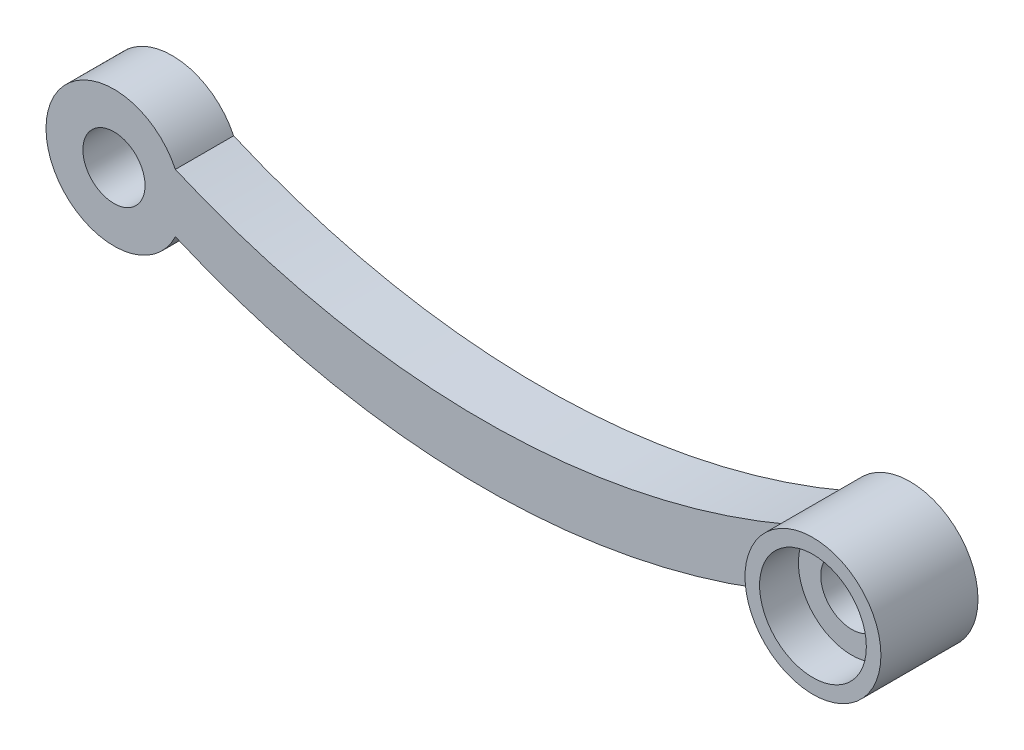
ISO-10303-21;
HEADER;
FILE_DESCRIPTION(('STEP AP214'),'2;1');
FILE_NAME('part.step','',(''),(''),'','','');
FILE_SCHEMA(('AUTOMOTIVE_DESIGN { 1 0 10303 214 1 1 1 1 }'));
ENDSEC;
DATA;
#1=APPLICATION_CONTEXT('core data for automotive mechanical design processes');
#2=APPLICATION_PROTOCOL_DEFINITION('international standard','automotive_design',2000,#1);
#3=PRODUCT_CONTEXT('',#1,'mechanical');
#4=PRODUCT('Part','Part','',(#3));
#5=PRODUCT_RELATED_PRODUCT_CATEGORY('part','',(#4));
#6=PRODUCT_DEFINITION_FORMATION('','',#4);
#7=PRODUCT_DEFINITION_CONTEXT('part definition',#1,'design');
#8=PRODUCT_DEFINITION('design','',#6,#7);
#9=PRODUCT_DEFINITION_SHAPE('','',#8);
#10=(LENGTH_UNIT() NAMED_UNIT(*) SI_UNIT(.MILLI.,.METRE.));
#11=(NAMED_UNIT(*) PLANE_ANGLE_UNIT() SI_UNIT($,.RADIAN.));
#12=(NAMED_UNIT(*) SI_UNIT($,.STERADIAN.) SOLID_ANGLE_UNIT());
#13=UNCERTAINTY_MEASURE_WITH_UNIT(LENGTH_MEASURE(1.E-05),#10,'distance_accuracy_value','');
#14=(GEOMETRIC_REPRESENTATION_CONTEXT(3) GLOBAL_UNCERTAINTY_ASSIGNED_CONTEXT((#13)) GLOBAL_UNIT_ASSIGNED_CONTEXT((#10,
#11,#12)) REPRESENTATION_CONTEXT('',''));
#15=CARTESIAN_POINT('',(0.,0.,0.));
#16=DIRECTION('',(0.,0.,1.));
#17=DIRECTION('',(1.,0.,0.));
#18=AXIS2_PLACEMENT_3D('',#15,#16,#17);
#19=CARTESIAN_POINT('',(0.,0.,3.));
#20=DIRECTION('',(0.,0.,1.));
#21=DIRECTION('',(1.,0.,0.));
#22=AXIS2_PLACEMENT_3D('',#19,#20,#21);
#23=PLANE('',#22);
#24=CARTESIAN_POINT('',(19.,0.,3.));
#25=DIRECTION('',(0.,0.,1.));
#26=DIRECTION('',(1.,0.,0.));
#27=AXIS2_PLACEMENT_3D('',#24,#25,#26);
#28=CIRCLE('',#27,1.6);
#29=CARTESIAN_POINT('',(20.6,0.,3.));
#30=VERTEX_POINT('',#29);
#31=EDGE_CURVE('E117',#30,#30,#28,.F.);
#32=ORIENTED_EDGE('',*,*,#31,.T.);
#33=EDGE_LOOP('',(#32));
#34=FACE_BOUND('',#33,.T.);
#35=CARTESIAN_POINT('',(19.,0.,3.));
#36=DIRECTION('',(0.,0.,1.));
#37=DIRECTION('',(1.,0.,0.));
#38=AXIS2_PLACEMENT_3D('',#35,#36,#37);
#39=CIRCLE('',#38,2.74999999999999);
#40=CARTESIAN_POINT('',(21.75,0.,3.));
#41=VERTEX_POINT('',#40);
#42=EDGE_CURVE('E275',#41,#41,#39,.T.);
#43=ORIENTED_EDGE('',*,*,#42,.T.);
#44=EDGE_LOOP('',(#43));
#45=FACE_BOUND('',#44,.T.);
#46=ADVANCED_FACE('F57',(#34,#45),#23,.T.);
#47=CARTESIAN_POINT('',(0.,38.2310025875472,3.));
#48=DIRECTION('',(0.,0.,-1.));
#49=DIRECTION('',(-1.,0.,0.));
#50=AXIS2_PLACEMENT_3D('',#47,#48,#49);
#51=CYLINDRICAL_SURFACE('',#50,40.);
#52=CARTESIAN_POINT('',(0.,38.2310025875472,0.));
#53=DIRECTION('',(0.,0.,1.));
#54=DIRECTION('',(1.,0.,0.));
#55=AXIS2_PLACEMENT_3D('',#52,#53,#54);
#56=CIRCLE('',#55,40.);
#57=CARTESIAN_POINT('',(-15.8377223398316,1.5,0.));
#58=VERTEX_POINT('',#57);
#59=CARTESIAN_POINT('',(15.8377223398316,1.5,0.));
#60=VERTEX_POINT('',#59);
#61=EDGE_CURVE('E141',#58,#60,#56,.T.);
#62=ORIENTED_EDGE('',*,*,#61,.F.);
#63=DIRECTION('',(0.,0.,-1.));
#64=VECTOR('',#63,1.);
#65=CARTESIAN_POINT('',(-15.8377223398316,1.5,3.));
#66=LINE('',#65,#64);
#67=CARTESIAN_POINT('',(-15.8377223398316,1.5,3.));
#68=VERTEX_POINT('',#67);
#69=EDGE_CURVE('E13',#68,#58,#66,.T.);
#70=ORIENTED_EDGE('',*,*,#69,.F.);
#71=CARTESIAN_POINT('',(0.,38.2310025875472,3.));
#72=DIRECTION('',(0.,0.,1.));
#73=DIRECTION('',(1.,0.,0.));
#74=AXIS2_PLACEMENT_3D('',#71,#72,#73);
#75=CIRCLE('',#74,40.);
#76=CARTESIAN_POINT('',(15.8377223398316,1.50000000000004,3.));
#77=VERTEX_POINT('',#76);
#78=EDGE_CURVE('E105',#68,#77,#75,.T.);
#79=ORIENTED_EDGE('',*,*,#78,.T.);
#80=DIRECTION('',(0.,0.,-1.));
#81=VECTOR('',#80,1.);
#82=CARTESIAN_POINT('',(15.8377223398316,1.5,3.));
#83=LINE('',#82,#81);
#84=EDGE_CURVE('E96',#77,#60,#83,.T.);
#85=ORIENTED_EDGE('',*,*,#84,.T.);
#86=EDGE_LOOP('',(#62,#70,#79,#85));
#87=FACE_BOUND('',#86,.T.);
#88=ADVANCED_FACE('F59',(#87),#51,.F.);
#89=CARTESIAN_POINT('',(-19.,0.,3.));
#90=DIRECTION('',(0.,0.,-1.));
#91=DIRECTION('',(-1.,0.,0.));
#92=AXIS2_PLACEMENT_3D('',#89,#90,#91);
#93=CYLINDRICAL_SURFACE('',#92,3.5);
#94=CARTESIAN_POINT('',(-19.,0.,0.));
#95=DIRECTION('',(0.,0.,1.));
#96=DIRECTION('',(1.,0.,0.));
#97=AXIS2_PLACEMENT_3D('',#94,#95,#96);
#98=CIRCLE('',#97,3.5);
#99=CARTESIAN_POINT('',(-15.8377223398316,-1.5,0.));
#100=VERTEX_POINT('',#99);
#101=EDGE_CURVE('E144',#58,#100,#98,.T.);
#102=ORIENTED_EDGE('',*,*,#101,.T.);
#103=DIRECTION('',(0.,0.,-1.));
#104=VECTOR('',#103,1.);
#105=CARTESIAN_POINT('',(-15.8377223398316,-1.5,3.));
#106=LINE('',#105,#104);
#107=CARTESIAN_POINT('',(-15.8377223398316,-1.5,3.));
#108=VERTEX_POINT('',#107);
#109=EDGE_CURVE('E67',#108,#100,#106,.T.);
#110=ORIENTED_EDGE('',*,*,#109,.F.);
#111=CARTESIAN_POINT('',(-19.,0.,3.));
#112=DIRECTION('',(0.,0.,1.));
#113=DIRECTION('',(1.,0.,0.));
#114=AXIS2_PLACEMENT_3D('',#111,#112,#113);
#115=CIRCLE('',#114,3.5);
#116=EDGE_CURVE('E120',#68,#108,#115,.T.);
#117=ORIENTED_EDGE('',*,*,#116,.F.);
#118=ORIENTED_EDGE('',*,*,#69,.T.);
#119=EDGE_LOOP('',(#102,#110,#117,#118));
#120=FACE_BOUND('',#119,.T.);
#121=ADVANCED_FACE('F168',(#120),#93,.T.);
#122=CARTESIAN_POINT('',(0.,35.2310025875472,3.));
#123=DIRECTION('',(0.,0.,-1.));
#124=DIRECTION('',(-1.,0.,0.));
#125=AXIS2_PLACEMENT_3D('',#122,#123,#124);
#126=CYLINDRICAL_SURFACE('',#125,40.);
#127=CARTESIAN_POINT('',(0.,35.2310025875472,0.));
#128=DIRECTION('',(0.,0.,1.));
#129=DIRECTION('',(1.,0.,0.));
#130=AXIS2_PLACEMENT_3D('',#127,#128,#129);
#131=CIRCLE('',#130,40.);
#132=CARTESIAN_POINT('',(15.8377223398316,-1.5,0.));
#133=VERTEX_POINT('',#132);
#134=EDGE_CURVE('E147',#100,#133,#131,.T.);
#135=ORIENTED_EDGE('',*,*,#134,.T.);
#136=DIRECTION('',(0.,0.,-1.));
#137=VECTOR('',#136,1.);
#138=CARTESIAN_POINT('',(15.8377223398316,-1.5,3.));
#139=LINE('',#138,#137);
#140=CARTESIAN_POINT('',(15.8377223398316,-1.5,3.));
#141=VERTEX_POINT('',#140);
#142=EDGE_CURVE('E90',#141,#133,#139,.T.);
#143=ORIENTED_EDGE('',*,*,#142,.F.);
#144=CARTESIAN_POINT('',(0.,35.2310025875472,3.));
#145=DIRECTION('',(0.,0.,1.));
#146=DIRECTION('',(1.,0.,0.));
#147=AXIS2_PLACEMENT_3D('',#144,#145,#146);
#148=CIRCLE('',#147,40.);
#149=EDGE_CURVE('E107',#108,#141,#148,.T.);
#150=ORIENTED_EDGE('',*,*,#149,.F.);
#151=ORIENTED_EDGE('',*,*,#109,.T.);
#152=EDGE_LOOP('',(#135,#143,#150,#151));
#153=FACE_BOUND('',#152,.T.);
#154=ADVANCED_FACE('F162',(#153),#126,.T.);
#155=CARTESIAN_POINT('',(-19.,0.,3.));
#156=DIRECTION('',(0.,0.,-1.));
#157=DIRECTION('',(-1.,0.,0.));
#158=AXIS2_PLACEMENT_3D('',#155,#156,#157);
#159=CYLINDRICAL_SURFACE('',#158,1.6);
#160=CARTESIAN_POINT('',(-19.,0.,3.));
#161=DIRECTION('',(0.,0.,1.));
#162=DIRECTION('',(1.,0.,0.));
#163=AXIS2_PLACEMENT_3D('',#160,#161,#162);
#164=CIRCLE('',#163,1.6);
#165=CARTESIAN_POINT('',(-17.4,0.,3.));
#166=VERTEX_POINT('',#165);
#167=EDGE_CURVE('E134',#166,#166,#164,.T.);
#168=ORIENTED_EDGE('',*,*,#167,.T.);
#169=EDGE_LOOP('',(#168));
#170=FACE_BOUND('',#169,.T.);
#171=CARTESIAN_POINT('',(-19.,0.,0.));
#172=DIRECTION('',(0.,0.,1.));
#173=DIRECTION('',(1.,0.,0.));
#174=AXIS2_PLACEMENT_3D('',#171,#172,#173);
#175=CIRCLE('',#174,1.6);
#176=CARTESIAN_POINT('',(-17.4,0.,0.));
#177=VERTEX_POINT('',#176);
#178=EDGE_CURVE('E128',#177,#177,#175,.T.);
#179=ORIENTED_EDGE('',*,*,#178,.F.);
#180=EDGE_LOOP('',(#179));
#181=FACE_BOUND('',#180,.T.);
#182=ADVANCED_FACE('F174',(#170,#181),#159,.F.);
#183=CARTESIAN_POINT('',(19.,0.,3.));
#184=DIRECTION('',(0.,0.,-1.));
#185=DIRECTION('',(-1.,0.,0.));
#186=AXIS2_PLACEMENT_3D('',#183,#184,#185);
#187=CYLINDRICAL_SURFACE('',#186,3.5);
#188=CARTESIAN_POINT('',(19.,0.,0.));
#189=DIRECTION('',(0.,0.,1.));
#190=DIRECTION('',(1.,0.,0.));
#191=AXIS2_PLACEMENT_3D('',#188,#189,#190);
#192=CIRCLE('',#191,3.5);
#193=EDGE_CURVE('E115',#60,#133,#192,.F.);
#194=ORIENTED_EDGE('',*,*,#193,.F.);
#195=ORIENTED_EDGE('',*,*,#84,.F.);
#196=CARTESIAN_POINT('',(19.,0.,3.));
#197=DIRECTION('',(0.,0.,1.));
#198=DIRECTION('',(1.,0.,0.));
#199=AXIS2_PLACEMENT_3D('',#196,#197,#198);
#200=CIRCLE('',#199,3.50000000000001);
#201=EDGE_CURVE('E75',#77,#141,#200,.T.);
#202=ORIENTED_EDGE('',*,*,#201,.T.);
#203=ORIENTED_EDGE('',*,*,#142,.T.);
#204=EDGE_LOOP('',(#194,#195,#202,#203));
#205=FACE_BOUND('',#204,.T.);
#206=CARTESIAN_POINT('',(19.,0.,5.));
#207=DIRECTION('',(0.,0.,1.));
#208=DIRECTION('',(1.,0.,0.));
#209=AXIS2_PLACEMENT_3D('',#206,#207,#208);
#210=CIRCLE('',#209,3.50000000000001);
#211=CARTESIAN_POINT('',(22.5,0.,5.));
#212=VERTEX_POINT('',#211);
#213=EDGE_CURVE('E109',#212,#212,#210,.T.);
#214=ORIENTED_EDGE('',*,*,#213,.F.);
#215=EDGE_LOOP('',(#214));
#216=FACE_BOUND('',#215,.T.);
#217=ADVANCED_FACE('F112',(#205,#216),#187,.T.);
#218=CARTESIAN_POINT('',(19.,0.,3.));
#219=DIRECTION('',(0.,0.,-1.));
#220=DIRECTION('',(-1.,0.,0.));
#221=AXIS2_PLACEMENT_3D('',#218,#219,#220);
#222=CYLINDRICAL_SURFACE('',#221,1.6);
#223=ORIENTED_EDGE('',*,*,#31,.F.);
#224=EDGE_LOOP('',(#223));
#225=FACE_BOUND('',#224,.T.);
#226=CARTESIAN_POINT('',(19.,0.,0.));
#227=DIRECTION('',(0.,0.,1.));
#228=DIRECTION('',(1.,0.,0.));
#229=AXIS2_PLACEMENT_3D('',#226,#227,#228);
#230=CIRCLE('',#229,1.6);
#231=CARTESIAN_POINT('',(20.6,0.,0.));
#232=VERTEX_POINT('',#231);
#233=EDGE_CURVE('E121',#232,#232,#230,.F.);
#234=ORIENTED_EDGE('',*,*,#233,.T.);
#235=EDGE_LOOP('',(#234));
#236=FACE_BOUND('',#235,.T.);
#237=ADVANCED_FACE('F187',(#225,#236),#222,.F.);
#238=ORIENTED_EDGE('',*,*,#201,.F.);
#239=ORIENTED_EDGE('',*,*,#78,.F.);
#240=ORIENTED_EDGE('',*,*,#116,.T.);
#241=ORIENTED_EDGE('',*,*,#149,.T.);
#242=EDGE_LOOP('',(#238,#239,#240,#241));
#243=FACE_BOUND('',#242,.T.);
#244=ORIENTED_EDGE('',*,*,#167,.F.);
#245=EDGE_LOOP('',(#244));
#246=FACE_BOUND('',#245,.T.);
#247=ADVANCED_FACE('F103',(#243,#246),#23,.T.);
#248=CARTESIAN_POINT('',(0.,0.,0.));
#249=DIRECTION('',(0.,0.,1.));
#250=DIRECTION('',(1.,0.,0.));
#251=AXIS2_PLACEMENT_3D('',#248,#249,#250);
#252=PLANE('',#251);
#253=ORIENTED_EDGE('',*,*,#61,.T.);
#254=ORIENTED_EDGE('',*,*,#193,.T.);
#255=ORIENTED_EDGE('',*,*,#134,.F.);
#256=ORIENTED_EDGE('',*,*,#101,.F.);
#257=EDGE_LOOP('',(#253,#254,#255,#256));
#258=FACE_BOUND('',#257,.T.);
#259=ORIENTED_EDGE('',*,*,#178,.T.);
#260=EDGE_LOOP('',(#259));
#261=FACE_BOUND('',#260,.T.);
#262=ORIENTED_EDGE('',*,*,#233,.F.);
#263=EDGE_LOOP('',(#262));
#264=FACE_BOUND('',#263,.T.);
#265=ADVANCED_FACE('F166',(#258,#261,#264),#252,.F.);
#266=CARTESIAN_POINT('',(19.,0.,5.));
#267=DIRECTION('',(0.,0.,1.));
#268=DIRECTION('',(1.,0.,0.));
#269=AXIS2_PLACEMENT_3D('',#266,#267,#268);
#270=PLANE('',#269);
#271=ORIENTED_EDGE('',*,*,#213,.T.);
#272=EDGE_LOOP('',(#271));
#273=FACE_BOUND('',#272,.T.);
#274=CARTESIAN_POINT('',(19.,0.,5.));
#275=DIRECTION('',(0.,0.,1.));
#276=DIRECTION('',(1.,0.,0.));
#277=AXIS2_PLACEMENT_3D('',#274,#275,#276);
#278=CIRCLE('',#277,2.74999999999999);
#279=CARTESIAN_POINT('',(21.75,0.,5.));
#280=VERTEX_POINT('',#279);
#281=EDGE_CURVE('E110',#280,#280,#278,.T.);
#282=ORIENTED_EDGE('',*,*,#281,.F.);
#283=EDGE_LOOP('',(#282));
#284=FACE_BOUND('',#283,.T.);
#285=ADVANCED_FACE('F192',(#273,#284),#270,.T.);
#286=CARTESIAN_POINT('',(19.,0.,5.));
#287=DIRECTION('',(0.,0.,-1.));
#288=DIRECTION('',(-1.,0.,0.));
#289=AXIS2_PLACEMENT_3D('',#286,#287,#288);
#290=CYLINDRICAL_SURFACE('',#289,2.74999999999999);
#291=ORIENTED_EDGE('',*,*,#281,.T.);
#292=EDGE_LOOP('',(#291));
#293=FACE_BOUND('',#292,.T.);
#294=ORIENTED_EDGE('',*,*,#42,.F.);
#295=EDGE_LOOP('',(#294));
#296=FACE_BOUND('',#295,.T.);
#297=ADVANCED_FACE('F257',(#293,#296),#290,.F.);
#298=CLOSED_SHELL('',(#46,#88,#121,#154,#182,#217,#237,#247,#265,#285,#297));
#299=MANIFOLD_SOLID_BREP('B2',#298);
#300=ADVANCED_BREP_SHAPE_REPRESENTATION('',(#18,#299),#14);
#301=SHAPE_DEFINITION_REPRESENTATION(#9,#300);
ENDSEC;
END-ISO-10303-21;
